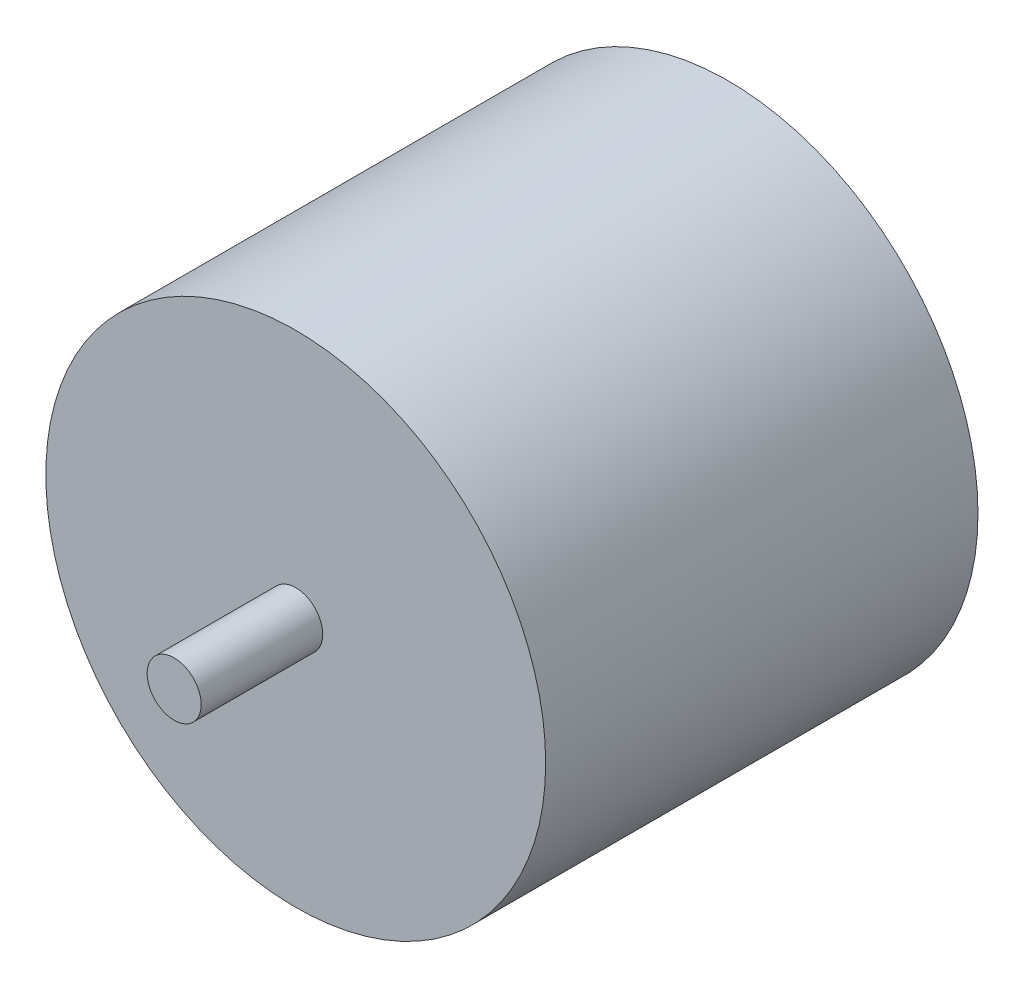
ISO-10303-21;
HEADER;
FILE_DESCRIPTION(('STEP AP214'),'2;1');
FILE_NAME('part.step','',(''),(''),'','','');
FILE_SCHEMA(('AUTOMOTIVE_DESIGN { 1 0 10303 214 1 1 1 1 }'));
ENDSEC;
DATA;
#1=APPLICATION_CONTEXT('core data for automotive mechanical design processes');
#2=APPLICATION_PROTOCOL_DEFINITION('international standard','automotive_design',2000,#1);
#3=PRODUCT_CONTEXT('',#1,'mechanical');
#4=PRODUCT('Part','Part','',(#3));
#5=PRODUCT_RELATED_PRODUCT_CATEGORY('part','',(#4));
#6=PRODUCT_DEFINITION_FORMATION('','',#4);
#7=PRODUCT_DEFINITION_CONTEXT('part definition',#1,'design');
#8=PRODUCT_DEFINITION('design','',#6,#7);
#9=PRODUCT_DEFINITION_SHAPE('','',#8);
#10=(LENGTH_UNIT() NAMED_UNIT(*) SI_UNIT(.MILLI.,.METRE.));
#11=(NAMED_UNIT(*) PLANE_ANGLE_UNIT() SI_UNIT($,.RADIAN.));
#12=(NAMED_UNIT(*) SI_UNIT($,.STERADIAN.) SOLID_ANGLE_UNIT());
#13=UNCERTAINTY_MEASURE_WITH_UNIT(LENGTH_MEASURE(1.E-05),#10,'distance_accuracy_value','');
#14=(GEOMETRIC_REPRESENTATION_CONTEXT(3) GLOBAL_UNCERTAINTY_ASSIGNED_CONTEXT((#13)) GLOBAL_UNIT_ASSIGNED_CONTEXT((#10,
#11,#12)) REPRESENTATION_CONTEXT('',''));
#15=CARTESIAN_POINT('',(0.,0.,0.));
#16=DIRECTION('',(0.,0.,1.));
#17=DIRECTION('',(1.,0.,0.));
#18=AXIS2_PLACEMENT_3D('',#15,#16,#17);
#19=CARTESIAN_POINT('',(0.,0.,-32.));
#20=DIRECTION('',(0.,0.,1.));
#21=DIRECTION('',(1.,0.,0.));
#22=AXIS2_PLACEMENT_3D('',#19,#20,#21);
#23=CYLINDRICAL_SURFACE('',#22,18.5);
#24=CARTESIAN_POINT('',(0.,0.,-32.));
#25=DIRECTION('',(0.,0.,1.));
#26=DIRECTION('',(1.,0.,0.));
#27=AXIS2_PLACEMENT_3D('',#24,#25,#26);
#28=CIRCLE('',#27,18.5);
#29=CARTESIAN_POINT('',(18.5,0.,-32.));
#30=VERTEX_POINT('',#29);
#31=EDGE_CURVE('E10',#30,#30,#28,.T.);
#32=ORIENTED_EDGE('',*,*,#31,.T.);
#33=EDGE_LOOP('',(#32));
#34=FACE_BOUND('',#33,.T.);
#35=CARTESIAN_POINT('',(0.,0.,0.));
#36=DIRECTION('',(0.,0.,1.));
#37=DIRECTION('',(1.,0.,0.));
#38=AXIS2_PLACEMENT_3D('',#35,#36,#37);
#39=CIRCLE('',#38,18.5);
#40=CARTESIAN_POINT('',(18.5,0.,0.));
#41=VERTEX_POINT('',#40);
#42=EDGE_CURVE('E37',#41,#41,#39,.T.);
#43=ORIENTED_EDGE('',*,*,#42,.F.);
#44=EDGE_LOOP('',(#43));
#45=FACE_BOUND('',#44,.T.);
#46=ADVANCED_FACE('F34',(#34,#45),#23,.T.);
#47=CARTESIAN_POINT('',(0.,0.,-32.));
#48=DIRECTION('',(0.,0.,1.));
#49=DIRECTION('',(1.,0.,0.));
#50=AXIS2_PLACEMENT_3D('',#47,#48,#49);
#51=PLANE('',#50);
#52=ORIENTED_EDGE('',*,*,#31,.F.);
#53=EDGE_LOOP('',(#52));
#54=FACE_BOUND('',#53,.T.);
#55=ADVANCED_FACE('F63',(#54),#51,.F.);
#56=CARTESIAN_POINT('',(0.,0.,0.));
#57=DIRECTION('',(0.,0.,1.));
#58=DIRECTION('',(1.,0.,0.));
#59=AXIS2_PLACEMENT_3D('',#56,#57,#58);
#60=PLANE('',#59);
#61=CARTESIAN_POINT('',(0.,0.,0.));
#62=DIRECTION('',(0.,0.,1.));
#63=DIRECTION('',(1.,0.,0.));
#64=AXIS2_PLACEMENT_3D('',#61,#62,#63);
#65=CIRCLE('',#64,2.);
#66=CARTESIAN_POINT('',(2.,0.,0.));
#67=VERTEX_POINT('',#66);
#68=EDGE_CURVE('E46',#67,#67,#65,.T.);
#69=ORIENTED_EDGE('',*,*,#68,.F.);
#70=EDGE_LOOP('',(#69));
#71=FACE_BOUND('',#70,.T.);
#72=ORIENTED_EDGE('',*,*,#42,.T.);
#73=EDGE_LOOP('',(#72));
#74=FACE_BOUND('',#73,.T.);
#75=ADVANCED_FACE('F57',(#71,#74),#60,.T.);
#76=CARTESIAN_POINT('',(0.,0.,9.));
#77=DIRECTION('',(0.,0.,-1.));
#78=DIRECTION('',(-1.,0.,0.));
#79=AXIS2_PLACEMENT_3D('',#76,#77,#78);
#80=CYLINDRICAL_SURFACE('',#79,2.);
#81=CARTESIAN_POINT('',(0.,0.,9.));
#82=DIRECTION('',(0.,0.,1.));
#83=DIRECTION('',(1.,0.,0.));
#84=AXIS2_PLACEMENT_3D('',#81,#82,#83);
#85=CIRCLE('',#84,2.);
#86=CARTESIAN_POINT('',(2.,0.,9.));
#87=VERTEX_POINT('',#86);
#88=EDGE_CURVE('E44',#87,#87,#85,.T.);
#89=ORIENTED_EDGE('',*,*,#88,.F.);
#90=EDGE_LOOP('',(#89));
#91=FACE_BOUND('',#90,.T.);
#92=ORIENTED_EDGE('',*,*,#68,.T.);
#93=EDGE_LOOP('',(#92));
#94=FACE_BOUND('',#93,.T.);
#95=ADVANCED_FACE('F54',(#91,#94),#80,.T.);
#96=CARTESIAN_POINT('',(0.,0.,9.));
#97=DIRECTION('',(0.,0.,1.));
#98=DIRECTION('',(1.,0.,0.));
#99=AXIS2_PLACEMENT_3D('',#96,#97,#98);
#100=PLANE('',#99);
#101=ORIENTED_EDGE('',*,*,#88,.T.);
#102=EDGE_LOOP('',(#101));
#103=FACE_BOUND('',#102,.T.);
#104=ADVANCED_FACE('F52',(#103),#100,.T.);
#105=CLOSED_SHELL('',(#46,#55,#75,#95,#104));
#106=MANIFOLD_SOLID_BREP('B2',#105);
#107=ADVANCED_BREP_SHAPE_REPRESENTATION('',(#18,#106),#14);
#108=SHAPE_DEFINITION_REPRESENTATION(#9,#107);
ENDSEC;
END-ISO-10303-21;
